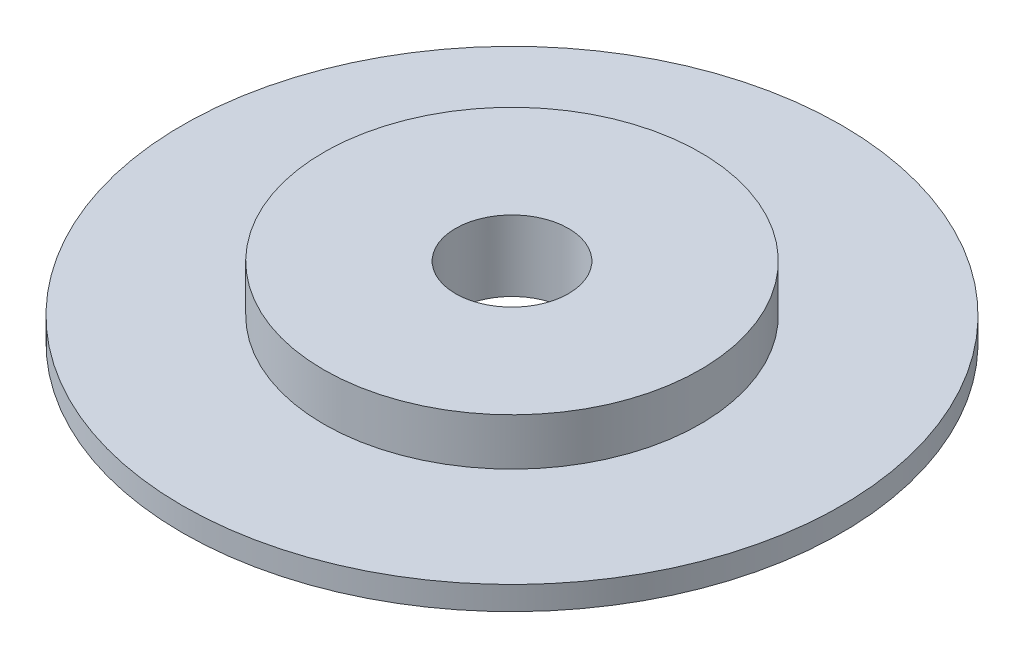
ISO-10303-21;
HEADER;
FILE_DESCRIPTION(('STEP AP214'),'2;1');
FILE_NAME('part.step','',(''),(''),'','','');
FILE_SCHEMA(('AUTOMOTIVE_DESIGN { 1 0 10303 214 1 1 1 1 }'));
ENDSEC;
DATA;
#1=APPLICATION_CONTEXT('core data for automotive mechanical design processes');
#2=APPLICATION_PROTOCOL_DEFINITION('international standard','automotive_design',2000,#1);
#3=PRODUCT_CONTEXT('',#1,'mechanical');
#4=PRODUCT('Part','Part','',(#3));
#5=PRODUCT_RELATED_PRODUCT_CATEGORY('part','',(#4));
#6=PRODUCT_DEFINITION_FORMATION('','',#4);
#7=PRODUCT_DEFINITION_CONTEXT('part definition',#1,'design');
#8=PRODUCT_DEFINITION('design','',#6,#7);
#9=PRODUCT_DEFINITION_SHAPE('','',#8);
#10=(LENGTH_UNIT() NAMED_UNIT(*) SI_UNIT(.MILLI.,.METRE.));
#11=(NAMED_UNIT(*) PLANE_ANGLE_UNIT() SI_UNIT($,.RADIAN.));
#12=(NAMED_UNIT(*) SI_UNIT($,.STERADIAN.) SOLID_ANGLE_UNIT());
#13=UNCERTAINTY_MEASURE_WITH_UNIT(LENGTH_MEASURE(1.E-05),#10,'distance_accuracy_value','');
#14=(GEOMETRIC_REPRESENTATION_CONTEXT(3) GLOBAL_UNCERTAINTY_ASSIGNED_CONTEXT((#13)) GLOBAL_UNIT_ASSIGNED_CONTEXT((#10,
#11,#12)) REPRESENTATION_CONTEXT('',''));
#15=CARTESIAN_POINT('',(0.,0.,0.));
#16=DIRECTION('',(0.,0.,1.));
#17=DIRECTION('',(1.,0.,0.));
#18=AXIS2_PLACEMENT_3D('',#15,#16,#17);
#19=CARTESIAN_POINT('',(0.,1.5,0.));
#20=DIRECTION('',(0.,-1.,0.));
#21=DIRECTION('',(0.,0.,-1.));
#22=AXIS2_PLACEMENT_3D('',#19,#20,#21);
#23=CYLINDRICAL_SURFACE('',#22,7.);
#24=CARTESIAN_POINT('',(0.,0.,0.));
#25=DIRECTION('',(0.,1.,0.));
#26=DIRECTION('',(0.,0.,1.));
#27=AXIS2_PLACEMENT_3D('',#24,#25,#26);
#28=CIRCLE('',#27,7.);
#29=CARTESIAN_POINT('',(0.,0.,7.));
#30=VERTEX_POINT('',#29);
#31=EDGE_CURVE('E10',#30,#30,#28,.T.);
#32=ORIENTED_EDGE('',*,*,#31,.T.);
#33=EDGE_LOOP('',(#32));
#34=FACE_BOUND('',#33,.T.);
#35=CARTESIAN_POINT('',(0.,0.5,0.));
#36=DIRECTION('',(0.,1.,0.));
#37=DIRECTION('',(0.,0.,1.));
#38=AXIS2_PLACEMENT_3D('',#35,#36,#37);
#39=CIRCLE('',#38,7.);
#40=CARTESIAN_POINT('',(0.,0.5,7.));
#41=VERTEX_POINT('',#40);
#42=EDGE_CURVE('E37',#41,#41,#39,.T.);
#43=ORIENTED_EDGE('',*,*,#42,.F.);
#44=EDGE_LOOP('',(#43));
#45=FACE_BOUND('',#44,.T.);
#46=ADVANCED_FACE('F31',(#34,#45),#23,.T.);
#47=CARTESIAN_POINT('',(0.,0.,0.));
#48=DIRECTION('',(0.,1.,0.));
#49=DIRECTION('',(0.,0.,1.));
#50=AXIS2_PLACEMENT_3D('',#47,#48,#49);
#51=PLANE('',#50);
#52=CARTESIAN_POINT('',(0.,0.,0.));
#53=DIRECTION('',(0.,-1.,0.));
#54=DIRECTION('',(0.,0.,-1.));
#55=AXIS2_PLACEMENT_3D('',#52,#53,#54);
#56=CIRCLE('',#55,1.2);
#57=CARTESIAN_POINT('',(0.,0.,-1.2));
#58=VERTEX_POINT('',#57);
#59=EDGE_CURVE('E53',#58,#58,#56,.T.);
#60=ORIENTED_EDGE('',*,*,#59,.F.);
#61=EDGE_LOOP('',(#60));
#62=FACE_BOUND('',#61,.T.);
#63=ORIENTED_EDGE('',*,*,#31,.F.);
#64=EDGE_LOOP('',(#63));
#65=FACE_BOUND('',#64,.T.);
#66=ADVANCED_FACE('F59',(#62,#65),#51,.F.);
#67=CARTESIAN_POINT('',(0.,0.5,0.));
#68=DIRECTION('',(0.,1.,0.));
#69=DIRECTION('',(0.,0.,1.));
#70=AXIS2_PLACEMENT_3D('',#67,#68,#69);
#71=PLANE('',#70);
#72=CARTESIAN_POINT('',(0.,0.5,0.));
#73=DIRECTION('',(0.,1.,0.));
#74=DIRECTION('',(0.,0.,1.));
#75=AXIS2_PLACEMENT_3D('',#72,#73,#74);
#76=CIRCLE('',#75,4.);
#77=CARTESIAN_POINT('',(0.,0.5,4.));
#78=VERTEX_POINT('',#77);
#79=EDGE_CURVE('E41',#78,#78,#76,.T.);
#80=ORIENTED_EDGE('',*,*,#79,.F.);
#81=EDGE_LOOP('',(#80));
#82=FACE_BOUND('',#81,.T.);
#83=ORIENTED_EDGE('',*,*,#42,.T.);
#84=EDGE_LOOP('',(#83));
#85=FACE_BOUND('',#84,.T.);
#86=ADVANCED_FACE('F62',(#82,#85),#71,.T.);
#87=CARTESIAN_POINT('',(0.,0.5,0.));
#88=DIRECTION('',(0.,1.,0.));
#89=DIRECTION('',(0.,0.,1.));
#90=AXIS2_PLACEMENT_3D('',#87,#88,#89);
#91=CYLINDRICAL_SURFACE('',#90,4.);
#92=ORIENTED_EDGE('',*,*,#79,.T.);
#93=EDGE_LOOP('',(#92));
#94=FACE_BOUND('',#93,.T.);
#95=CARTESIAN_POINT('',(0.,1.5,0.));
#96=DIRECTION('',(0.,1.,0.));
#97=DIRECTION('',(0.,0.,1.));
#98=AXIS2_PLACEMENT_3D('',#95,#96,#97);
#99=CIRCLE('',#98,4.);
#100=CARTESIAN_POINT('',(0.,1.5,4.));
#101=VERTEX_POINT('',#100);
#102=EDGE_CURVE('E45',#101,#101,#99,.T.);
#103=ORIENTED_EDGE('',*,*,#102,.F.);
#104=EDGE_LOOP('',(#103));
#105=FACE_BOUND('',#104,.T.);
#106=ADVANCED_FACE('F67',(#94,#105),#91,.T.);
#107=CARTESIAN_POINT('',(0.,1.5,0.));
#108=DIRECTION('',(0.,1.,0.));
#109=DIRECTION('',(0.,0.,1.));
#110=AXIS2_PLACEMENT_3D('',#107,#108,#109);
#111=PLANE('',#110);
#112=CARTESIAN_POINT('',(0.,1.5,0.));
#113=DIRECTION('',(0.,1.,0.));
#114=DIRECTION('',(0.,0.,1.));
#115=AXIS2_PLACEMENT_3D('',#112,#113,#114);
#116=CIRCLE('',#115,1.2);
#117=CARTESIAN_POINT('',(0.,1.5,1.2));
#118=VERTEX_POINT('',#117);
#119=EDGE_CURVE('E49',#118,#118,#116,.T.);
#120=ORIENTED_EDGE('',*,*,#119,.F.);
#121=EDGE_LOOP('',(#120));
#122=FACE_BOUND('',#121,.T.);
#123=ORIENTED_EDGE('',*,*,#102,.T.);
#124=EDGE_LOOP('',(#123));
#125=FACE_BOUND('',#124,.T.);
#126=ADVANCED_FACE('F71',(#122,#125),#111,.T.);
#127=CARTESIAN_POINT('',(0.,0.,0.));
#128=DIRECTION('',(0.,-1.,0.));
#129=DIRECTION('',(0.,0.,-1.));
#130=AXIS2_PLACEMENT_3D('',#127,#128,#129);
#131=CYLINDRICAL_SURFACE('',#130,1.2);
#132=ORIENTED_EDGE('',*,*,#119,.T.);
#133=EDGE_LOOP('',(#132));
#134=FACE_BOUND('',#133,.T.);
#135=ORIENTED_EDGE('',*,*,#59,.T.);
#136=EDGE_LOOP('',(#135));
#137=FACE_BOUND('',#136,.T.);
#138=ADVANCED_FACE('F57',(#134,#137),#131,.F.);
#139=CLOSED_SHELL('',(#46,#66,#86,#106,#126,#138));
#140=MANIFOLD_SOLID_BREP('B2',#139);
#141=ADVANCED_BREP_SHAPE_REPRESENTATION('',(#18,#140),#14);
#142=SHAPE_DEFINITION_REPRESENTATION(#9,#141);
ENDSEC;
END-ISO-10303-21;
